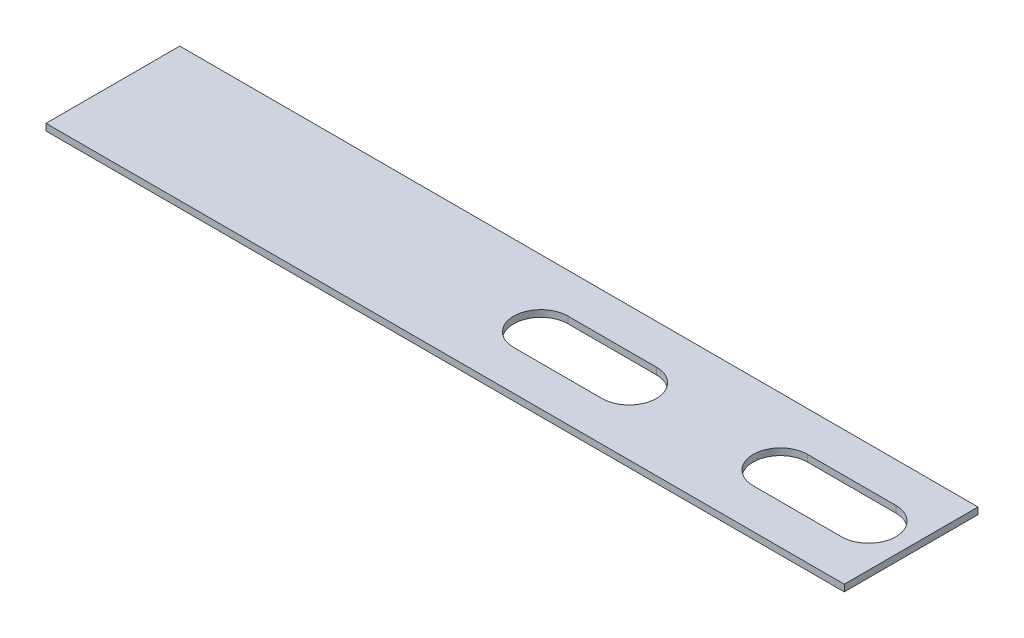
ISO-10303-21;
HEADER;
FILE_DESCRIPTION(('STEP AP214'),'2;1');
FILE_NAME('part.step','',(''),(''),'','','');
FILE_SCHEMA(('AUTOMOTIVE_DESIGN { 1 0 10303 214 1 1 1 1 }'));
ENDSEC;
DATA;
#1=APPLICATION_CONTEXT('core data for automotive mechanical design processes');
#2=APPLICATION_PROTOCOL_DEFINITION('international standard','automotive_design',2000,#1);
#3=PRODUCT_CONTEXT('',#1,'mechanical');
#4=PRODUCT('Part','Part','',(#3));
#5=PRODUCT_RELATED_PRODUCT_CATEGORY('part','',(#4));
#6=PRODUCT_DEFINITION_FORMATION('','',#4);
#7=PRODUCT_DEFINITION_CONTEXT('part definition',#1,'design');
#8=PRODUCT_DEFINITION('design','',#6,#7);
#9=PRODUCT_DEFINITION_SHAPE('','',#8);
#10=(LENGTH_UNIT() NAMED_UNIT(*) SI_UNIT(.MILLI.,.METRE.));
#11=(NAMED_UNIT(*) PLANE_ANGLE_UNIT() SI_UNIT($,.RADIAN.));
#12=(NAMED_UNIT(*) SI_UNIT($,.STERADIAN.) SOLID_ANGLE_UNIT());
#13=UNCERTAINTY_MEASURE_WITH_UNIT(LENGTH_MEASURE(1.E-05),#10,'distance_accuracy_value','');
#14=(GEOMETRIC_REPRESENTATION_CONTEXT(3) GLOBAL_UNCERTAINTY_ASSIGNED_CONTEXT((#13)) GLOBAL_UNIT_ASSIGNED_CONTEXT((#10,
#11,#12)) REPRESENTATION_CONTEXT('',''));
#15=CARTESIAN_POINT('',(0.,0.,0.));
#16=DIRECTION('',(0.,0.,1.));
#17=DIRECTION('',(1.,0.,0.));
#18=AXIS2_PLACEMENT_3D('',#15,#16,#17);
#19=CARTESIAN_POINT('',(0.,-0.5,10.));
#20=DIRECTION('',(0.,1.,0.));
#21=DIRECTION('',(0.,0.,1.));
#22=AXIS2_PLACEMENT_3D('',#19,#20,#21);
#23=PLANE('',#22);
#24=DIRECTION('',(-1.,0.,0.));
#25=VECTOR('',#24,1.);
#26=CARTESIAN_POINT('',(0.,-0.5,2.968));
#27=LINE('',#26,#25);
#28=CARTESIAN_POINT('',(56.515,-0.5,2.968));
#29=VERTEX_POINT('',#28);
#30=CARTESIAN_POINT('',(49.911,-0.5,2.968));
#31=VERTEX_POINT('',#30);
#32=EDGE_CURVE('E151',#29,#31,#27,.T.);
#33=ORIENTED_EDGE('',*,*,#32,.T.);
#34=CARTESIAN_POINT('',(49.911,-0.5,5.));
#35=DIRECTION('',(0.,1.,0.));
#36=DIRECTION('',(0.,0.,1.));
#37=AXIS2_PLACEMENT_3D('',#34,#35,#36);
#38=CIRCLE('',#37,2.032);
#39=CARTESIAN_POINT('',(49.911,-0.5,7.032));
#40=VERTEX_POINT('',#39);
#41=EDGE_CURVE('E154',#31,#40,#38,.T.);
#42=ORIENTED_EDGE('',*,*,#41,.T.);
#43=DIRECTION('',(1.,0.,0.));
#44=VECTOR('',#43,1.);
#45=CARTESIAN_POINT('',(0.,-0.5,7.032));
#46=LINE('',#45,#44);
#47=CARTESIAN_POINT('',(56.515,-0.5,7.032));
#48=VERTEX_POINT('',#47);
#49=EDGE_CURVE('E146',#40,#48,#46,.T.);
#50=ORIENTED_EDGE('',*,*,#49,.T.);
#51=CARTESIAN_POINT('',(56.515,-0.5,5.));
#52=DIRECTION('',(0.,1.,0.));
#53=DIRECTION('',(0.,0.,1.));
#54=AXIS2_PLACEMENT_3D('',#51,#52,#53);
#55=CIRCLE('',#54,2.032);
#56=EDGE_CURVE('E126',#48,#29,#55,.T.);
#57=ORIENTED_EDGE('',*,*,#56,.T.);
#58=EDGE_LOOP('',(#33,#42,#50,#57));
#59=FACE_BOUND('',#58,.T.);
#60=DIRECTION('',(-1.,0.,0.));
#61=VECTOR('',#60,1.);
#62=CARTESIAN_POINT('',(0.,-0.5,2.968));
#63=LINE('',#62,#61);
#64=CARTESIAN_POINT('',(38.608,-0.5,2.968));
#65=VERTEX_POINT('',#64);
#66=CARTESIAN_POINT('',(32.004,-0.5,2.968));
#67=VERTEX_POINT('',#66);
#68=EDGE_CURVE('E183',#65,#67,#63,.T.);
#69=ORIENTED_EDGE('',*,*,#68,.T.);
#70=CARTESIAN_POINT('',(32.004,-0.5,5.));
#71=DIRECTION('',(0.,1.,0.));
#72=DIRECTION('',(0.,0.,1.));
#73=AXIS2_PLACEMENT_3D('',#70,#71,#72);
#74=CIRCLE('',#73,2.032);
#75=CARTESIAN_POINT('',(32.004,-0.5,7.032));
#76=VERTEX_POINT('',#75);
#77=EDGE_CURVE('E186',#67,#76,#74,.T.);
#78=ORIENTED_EDGE('',*,*,#77,.T.);
#79=DIRECTION('',(1.,0.,0.));
#80=VECTOR('',#79,1.);
#81=CARTESIAN_POINT('',(0.,-0.5,7.032));
#82=LINE('',#81,#80);
#83=CARTESIAN_POINT('',(38.608,-0.5,7.032));
#84=VERTEX_POINT('',#83);
#85=EDGE_CURVE('E171',#76,#84,#82,.T.);
#86=ORIENTED_EDGE('',*,*,#85,.T.);
#87=CARTESIAN_POINT('',(38.608,-0.5,5.));
#88=DIRECTION('',(0.,1.,0.));
#89=DIRECTION('',(0.,0.,1.));
#90=AXIS2_PLACEMENT_3D('',#87,#88,#89);
#91=CIRCLE('',#90,2.032);
#92=EDGE_CURVE('E180',#84,#65,#91,.T.);
#93=ORIENTED_EDGE('',*,*,#92,.T.);
#94=EDGE_LOOP('',(#69,#78,#86,#93));
#95=FACE_BOUND('',#94,.T.);
#96=DIRECTION('',(1.,0.,0.));
#97=VECTOR('',#96,1.);
#98=CARTESIAN_POINT('',(0.,-0.5,0.));
#99=LINE('',#98,#97);
#100=CARTESIAN_POINT('',(0.,-0.5,0.));
#101=VERTEX_POINT('',#100);
#102=CARTESIAN_POINT('',(59.69,-0.5,0.));
#103=VERTEX_POINT('',#102);
#104=EDGE_CURVE('E189',#101,#103,#99,.T.);
#105=ORIENTED_EDGE('',*,*,#104,.T.);
#106=DIRECTION('',(0.,0.,-1.));
#107=VECTOR('',#106,1.);
#108=CARTESIAN_POINT('',(59.69,-0.5,10.));
#109=LINE('',#108,#107);
#110=CARTESIAN_POINT('',(59.69,-0.5,10.));
#111=VERTEX_POINT('',#110);
#112=EDGE_CURVE('E12',#111,#103,#109,.T.);
#113=ORIENTED_EDGE('',*,*,#112,.F.);
#114=DIRECTION('',(1.,0.,0.));
#115=VECTOR('',#114,1.);
#116=CARTESIAN_POINT('',(0.,-0.5,10.));
#117=LINE('',#116,#115);
#118=CARTESIAN_POINT('',(0.,-0.5,10.));
#119=VERTEX_POINT('',#118);
#120=EDGE_CURVE('E190',#119,#111,#117,.T.);
#121=ORIENTED_EDGE('',*,*,#120,.F.);
#122=DIRECTION('',(0.,0.,-1.));
#123=VECTOR('',#122,1.);
#124=CARTESIAN_POINT('',(0.,-0.5,10.));
#125=LINE('',#124,#123);
#126=EDGE_CURVE('E202',#119,#101,#125,.T.);
#127=ORIENTED_EDGE('',*,*,#126,.T.);
#128=EDGE_LOOP('',(#105,#113,#121,#127));
#129=FACE_BOUND('',#128,.T.);
#130=ADVANCED_FACE('F33',(#59,#95,#129),#23,.F.);
#131=CARTESIAN_POINT('',(59.69,0.,10.));
#132=DIRECTION('',(1.,0.,0.));
#133=DIRECTION('',(0.,0.,-1.));
#134=AXIS2_PLACEMENT_3D('',#131,#132,#133);
#135=PLANE('',#134);
#136=DIRECTION('',(0.,-1.,0.));
#137=VECTOR('',#136,1.);
#138=CARTESIAN_POINT('',(59.69,0.,0.));
#139=LINE('',#138,#137);
#140=CARTESIAN_POINT('',(59.69,0.,0.));
#141=VERTEX_POINT('',#140);
#142=EDGE_CURVE('E205',#141,#103,#139,.T.);
#143=ORIENTED_EDGE('',*,*,#142,.F.);
#144=DIRECTION('',(0.,0.,-1.));
#145=VECTOR('',#144,1.);
#146=CARTESIAN_POINT('',(59.69,0.,10.));
#147=LINE('',#146,#145);
#148=CARTESIAN_POINT('',(59.69,0.,10.));
#149=VERTEX_POINT('',#148);
#150=EDGE_CURVE('E40',#149,#141,#147,.T.);
#151=ORIENTED_EDGE('',*,*,#150,.F.);
#152=DIRECTION('',(0.,-1.,0.));
#153=VECTOR('',#152,1.);
#154=CARTESIAN_POINT('',(59.69,0.,10.));
#155=LINE('',#154,#153);
#156=EDGE_CURVE('E192',#149,#111,#155,.T.);
#157=ORIENTED_EDGE('',*,*,#156,.T.);
#158=ORIENTED_EDGE('',*,*,#112,.T.);
#159=EDGE_LOOP('',(#143,#151,#157,#158));
#160=FACE_BOUND('',#159,.T.);
#161=ADVANCED_FACE('F221',(#160),#135,.T.);
#162=CARTESIAN_POINT('',(0.,0.,10.));
#163=DIRECTION('',(0.,1.,0.));
#164=DIRECTION('',(0.,0.,1.));
#165=AXIS2_PLACEMENT_3D('',#162,#163,#164);
#166=PLANE('',#165);
#167=CARTESIAN_POINT('',(49.911,0.,5.));
#168=DIRECTION('',(0.,1.,0.));
#169=DIRECTION('',(0.,0.,1.));
#170=AXIS2_PLACEMENT_3D('',#167,#168,#169);
#171=CIRCLE('',#170,2.032);
#172=CARTESIAN_POINT('',(49.911,0.,2.968));
#173=VERTEX_POINT('',#172);
#174=CARTESIAN_POINT('',(49.911,0.,7.032));
#175=VERTEX_POINT('',#174);
#176=EDGE_CURVE('E55',#173,#175,#171,.T.);
#177=ORIENTED_EDGE('',*,*,#176,.F.);
#178=DIRECTION('',(-1.,0.,0.));
#179=VECTOR('',#178,1.);
#180=CARTESIAN_POINT('',(49.911,0.,2.968));
#181=LINE('',#180,#179);
#182=CARTESIAN_POINT('',(56.515,0.,2.968));
#183=VERTEX_POINT('',#182);
#184=EDGE_CURVE('E139',#183,#173,#181,.T.);
#185=ORIENTED_EDGE('',*,*,#184,.F.);
#186=CARTESIAN_POINT('',(56.515,0.,5.));
#187=DIRECTION('',(0.,1.,0.));
#188=DIRECTION('',(0.,0.,1.));
#189=AXIS2_PLACEMENT_3D('',#186,#187,#188);
#190=CIRCLE('',#189,2.032);
#191=CARTESIAN_POINT('',(56.515,0.,7.032));
#192=VERTEX_POINT('',#191);
#193=EDGE_CURVE('E123',#192,#183,#190,.T.);
#194=ORIENTED_EDGE('',*,*,#193,.F.);
#195=DIRECTION('',(1.,0.,0.));
#196=VECTOR('',#195,1.);
#197=CARTESIAN_POINT('',(49.911,0.,7.032));
#198=LINE('',#197,#196);
#199=EDGE_CURVE('E132',#175,#192,#198,.T.);
#200=ORIENTED_EDGE('',*,*,#199,.F.);
#201=EDGE_LOOP('',(#177,#185,#194,#200));
#202=FACE_BOUND('',#201,.T.);
#203=CARTESIAN_POINT('',(32.004,0.,5.));
#204=DIRECTION('',(0.,1.,0.));
#205=DIRECTION('',(0.,0.,1.));
#206=AXIS2_PLACEMENT_3D('',#203,#204,#205);
#207=CIRCLE('',#206,2.032);
#208=CARTESIAN_POINT('',(32.004,0.,2.968));
#209=VERTEX_POINT('',#208);
#210=CARTESIAN_POINT('',(32.004,0.,7.032));
#211=VERTEX_POINT('',#210);
#212=EDGE_CURVE('E157',#209,#211,#207,.T.);
#213=ORIENTED_EDGE('',*,*,#212,.F.);
#214=DIRECTION('',(-1.,0.,0.));
#215=VECTOR('',#214,1.);
#216=CARTESIAN_POINT('',(32.004,0.,2.968));
#217=LINE('',#216,#215);
#218=CARTESIAN_POINT('',(38.608,0.,2.968));
#219=VERTEX_POINT('',#218);
#220=EDGE_CURVE('E165',#219,#209,#217,.T.);
#221=ORIENTED_EDGE('',*,*,#220,.F.);
#222=CARTESIAN_POINT('',(38.608,0.,5.));
#223=DIRECTION('',(0.,1.,0.));
#224=DIRECTION('',(0.,0.,1.));
#225=AXIS2_PLACEMENT_3D('',#222,#223,#224);
#226=CIRCLE('',#225,2.032);
#227=CARTESIAN_POINT('',(38.608,0.,7.032));
#228=VERTEX_POINT('',#227);
#229=EDGE_CURVE('E162',#228,#219,#226,.T.);
#230=ORIENTED_EDGE('',*,*,#229,.F.);
#231=DIRECTION('',(1.,0.,0.));
#232=VECTOR('',#231,1.);
#233=CARTESIAN_POINT('',(32.004,0.,7.032));
#234=LINE('',#233,#232);
#235=EDGE_CURVE('E159',#211,#228,#234,.T.);
#236=ORIENTED_EDGE('',*,*,#235,.F.);
#237=EDGE_LOOP('',(#213,#221,#230,#236));
#238=FACE_BOUND('',#237,.T.);
#239=DIRECTION('',(1.,0.,0.));
#240=VECTOR('',#239,1.);
#241=CARTESIAN_POINT('',(0.,0.,0.));
#242=LINE('',#241,#240);
#243=CARTESIAN_POINT('',(0.,0.,0.));
#244=VERTEX_POINT('',#243);
#245=EDGE_CURVE('E208',#244,#141,#242,.T.);
#246=ORIENTED_EDGE('',*,*,#245,.F.);
#247=DIRECTION('',(0.,0.,-1.));
#248=VECTOR('',#247,1.);
#249=CARTESIAN_POINT('',(0.,0.,10.));
#250=LINE('',#249,#248);
#251=CARTESIAN_POINT('',(0.,0.,10.));
#252=VERTEX_POINT('',#251);
#253=EDGE_CURVE('E214',#252,#244,#250,.T.);
#254=ORIENTED_EDGE('',*,*,#253,.F.);
#255=DIRECTION('',(1.,0.,0.));
#256=VECTOR('',#255,1.);
#257=CARTESIAN_POINT('',(0.,0.,10.));
#258=LINE('',#257,#256);
#259=EDGE_CURVE('E196',#252,#149,#258,.T.);
#260=ORIENTED_EDGE('',*,*,#259,.T.);
#261=ORIENTED_EDGE('',*,*,#150,.T.);
#262=EDGE_LOOP('',(#246,#254,#260,#261));
#263=FACE_BOUND('',#262,.T.);
#264=ADVANCED_FACE('F136',(#202,#238,#263),#166,.T.);
#265=CARTESIAN_POINT('',(0.,-0.5,10.));
#266=DIRECTION('',(-1.,0.,0.));
#267=DIRECTION('',(0.,0.,1.));
#268=AXIS2_PLACEMENT_3D('',#265,#266,#267);
#269=PLANE('',#268);
#270=DIRECTION('',(0.,1.,0.));
#271=VECTOR('',#270,1.);
#272=CARTESIAN_POINT('',(0.,-0.5,0.));
#273=LINE('',#272,#271);
#274=EDGE_CURVE('E193',#101,#244,#273,.T.);
#275=ORIENTED_EDGE('',*,*,#274,.F.);
#276=ORIENTED_EDGE('',*,*,#126,.F.);
#277=DIRECTION('',(0.,1.,0.));
#278=VECTOR('',#277,1.);
#279=CARTESIAN_POINT('',(0.,-0.5,10.));
#280=LINE('',#279,#278);
#281=EDGE_CURVE('E199',#119,#252,#280,.T.);
#282=ORIENTED_EDGE('',*,*,#281,.T.);
#283=ORIENTED_EDGE('',*,*,#253,.T.);
#284=EDGE_LOOP('',(#275,#276,#282,#283));
#285=FACE_BOUND('',#284,.T.);
#286=ADVANCED_FACE('F228',(#285),#269,.T.);
#287=CARTESIAN_POINT('',(59.69,-0.5,10.));
#288=DIRECTION('',(0.,0.,-1.));
#289=DIRECTION('',(-1.,0.,0.));
#290=AXIS2_PLACEMENT_3D('',#287,#288,#289);
#291=PLANE('',#290);
#292=ORIENTED_EDGE('',*,*,#120,.T.);
#293=ORIENTED_EDGE('',*,*,#156,.F.);
#294=ORIENTED_EDGE('',*,*,#259,.F.);
#295=ORIENTED_EDGE('',*,*,#281,.F.);
#296=EDGE_LOOP('',(#292,#293,#294,#295));
#297=FACE_BOUND('',#296,.T.);
#298=ADVANCED_FACE('F232',(#297),#291,.F.);
#299=CARTESIAN_POINT('',(59.69,-0.5,0.));
#300=DIRECTION('',(0.,0.,-1.));
#301=DIRECTION('',(-1.,0.,0.));
#302=AXIS2_PLACEMENT_3D('',#299,#300,#301);
#303=PLANE('',#302);
#304=ORIENTED_EDGE('',*,*,#104,.F.);
#305=ORIENTED_EDGE('',*,*,#274,.T.);
#306=ORIENTED_EDGE('',*,*,#245,.T.);
#307=ORIENTED_EDGE('',*,*,#142,.T.);
#308=EDGE_LOOP('',(#304,#305,#306,#307));
#309=FACE_BOUND('',#308,.T.);
#310=ADVANCED_FACE('F225',(#309),#303,.T.);
#311=CARTESIAN_POINT('',(32.004,-2.54,5.));
#312=DIRECTION('',(0.,1.,0.));
#313=DIRECTION('',(0.,0.,1.));
#314=AXIS2_PLACEMENT_3D('',#311,#312,#313);
#315=CYLINDRICAL_SURFACE('',#314,2.032);
#316=DIRECTION('',(0.,1.,0.));
#317=VECTOR('',#316,1.);
#318=CARTESIAN_POINT('',(32.004,-2.54,2.968));
#319=LINE('',#318,#317);
#320=EDGE_CURVE('E169',#67,#209,#319,.T.);
#321=ORIENTED_EDGE('',*,*,#320,.T.);
#322=ORIENTED_EDGE('',*,*,#212,.T.);
#323=DIRECTION('',(0.,1.,0.));
#324=VECTOR('',#323,1.);
#325=CARTESIAN_POINT('',(32.004,-2.54,7.032));
#326=LINE('',#325,#324);
#327=EDGE_CURVE('E168',#76,#211,#326,.T.);
#328=ORIENTED_EDGE('',*,*,#327,.F.);
#329=ORIENTED_EDGE('',*,*,#77,.F.);
#330=EDGE_LOOP('',(#321,#322,#328,#329));
#331=FACE_BOUND('',#330,.T.);
#332=ADVANCED_FACE('F253',(#331),#315,.F.);
#333=CARTESIAN_POINT('',(32.004,-2.54,2.968));
#334=DIRECTION('',(0.,0.,-1.));
#335=DIRECTION('',(-1.,0.,0.));
#336=AXIS2_PLACEMENT_3D('',#333,#334,#335);
#337=PLANE('',#336);
#338=DIRECTION('',(0.,1.,0.));
#339=VECTOR('',#338,1.);
#340=CARTESIAN_POINT('',(38.608,-2.54,2.968));
#341=LINE('',#340,#339);
#342=EDGE_CURVE('E172',#65,#219,#341,.T.);
#343=ORIENTED_EDGE('',*,*,#342,.T.);
#344=ORIENTED_EDGE('',*,*,#220,.T.);
#345=ORIENTED_EDGE('',*,*,#320,.F.);
#346=ORIENTED_EDGE('',*,*,#68,.F.);
#347=EDGE_LOOP('',(#343,#344,#345,#346));
#348=FACE_BOUND('',#347,.T.);
#349=ADVANCED_FACE('F244',(#348),#337,.F.);
#350=CARTESIAN_POINT('',(38.608,-2.54,5.));
#351=DIRECTION('',(0.,1.,0.));
#352=DIRECTION('',(0.,0.,1.));
#353=AXIS2_PLACEMENT_3D('',#350,#351,#352);
#354=CYLINDRICAL_SURFACE('',#353,2.032);
#355=DIRECTION('',(0.,1.,0.));
#356=VECTOR('',#355,1.);
#357=CARTESIAN_POINT('',(38.608,-2.54,7.032));
#358=LINE('',#357,#356);
#359=EDGE_CURVE('E174',#84,#228,#358,.T.);
#360=ORIENTED_EDGE('',*,*,#359,.T.);
#361=ORIENTED_EDGE('',*,*,#229,.T.);
#362=ORIENTED_EDGE('',*,*,#342,.F.);
#363=ORIENTED_EDGE('',*,*,#92,.F.);
#364=EDGE_LOOP('',(#360,#361,#362,#363));
#365=FACE_BOUND('',#364,.T.);
#366=ADVANCED_FACE('F246',(#365),#354,.F.);
#367=CARTESIAN_POINT('',(32.004,-2.54,7.032));
#368=DIRECTION('',(0.,0.,1.));
#369=DIRECTION('',(1.,0.,0.));
#370=AXIS2_PLACEMENT_3D('',#367,#368,#369);
#371=PLANE('',#370);
#372=ORIENTED_EDGE('',*,*,#327,.T.);
#373=ORIENTED_EDGE('',*,*,#235,.T.);
#374=ORIENTED_EDGE('',*,*,#359,.F.);
#375=ORIENTED_EDGE('',*,*,#85,.F.);
#376=EDGE_LOOP('',(#372,#373,#374,#375));
#377=FACE_BOUND('',#376,.T.);
#378=ADVANCED_FACE('F255',(#377),#371,.F.);
#379=CARTESIAN_POINT('',(49.911,-2.54,5.));
#380=DIRECTION('',(0.,1.,0.));
#381=DIRECTION('',(0.,0.,1.));
#382=AXIS2_PLACEMENT_3D('',#379,#380,#381);
#383=CYLINDRICAL_SURFACE('',#382,2.032);
#384=DIRECTION('',(0.,1.,0.));
#385=VECTOR('',#384,1.);
#386=CARTESIAN_POINT('',(49.911,-2.54,2.968));
#387=LINE('',#386,#385);
#388=EDGE_CURVE('E144',#31,#173,#387,.T.);
#389=ORIENTED_EDGE('',*,*,#388,.T.);
#390=ORIENTED_EDGE('',*,*,#176,.T.);
#391=DIRECTION('',(0.,1.,0.));
#392=VECTOR('',#391,1.);
#393=CARTESIAN_POINT('',(49.911,-2.54,7.032));
#394=LINE('',#393,#392);
#395=EDGE_CURVE('E129',#40,#175,#394,.T.);
#396=ORIENTED_EDGE('',*,*,#395,.F.);
#397=ORIENTED_EDGE('',*,*,#41,.F.);
#398=EDGE_LOOP('',(#389,#390,#396,#397));
#399=FACE_BOUND('',#398,.T.);
#400=ADVANCED_FACE('F257',(#399),#383,.F.);
#401=CARTESIAN_POINT('',(49.911,-2.54,2.968));
#402=DIRECTION('',(0.,0.,-1.));
#403=DIRECTION('',(-1.,0.,0.));
#404=AXIS2_PLACEMENT_3D('',#401,#402,#403);
#405=PLANE('',#404);
#406=DIRECTION('',(0.,1.,0.));
#407=VECTOR('',#406,1.);
#408=CARTESIAN_POINT('',(56.515,-2.54,2.968));
#409=LINE('',#408,#407);
#410=EDGE_CURVE('E128',#29,#183,#409,.T.);
#411=ORIENTED_EDGE('',*,*,#410,.T.);
#412=ORIENTED_EDGE('',*,*,#184,.T.);
#413=ORIENTED_EDGE('',*,*,#388,.F.);
#414=ORIENTED_EDGE('',*,*,#32,.F.);
#415=EDGE_LOOP('',(#411,#412,#413,#414));
#416=FACE_BOUND('',#415,.T.);
#417=ADVANCED_FACE('F263',(#416),#405,.F.);
#418=CARTESIAN_POINT('',(56.515,-2.54,5.));
#419=DIRECTION('',(0.,1.,0.));
#420=DIRECTION('',(0.,0.,1.));
#421=AXIS2_PLACEMENT_3D('',#418,#419,#420);
#422=CYLINDRICAL_SURFACE('',#421,2.032);
#423=DIRECTION('',(0.,1.,0.));
#424=VECTOR('',#423,1.);
#425=CARTESIAN_POINT('',(56.515,-2.54,7.032));
#426=LINE('',#425,#424);
#427=EDGE_CURVE('E47',#48,#192,#426,.T.);
#428=ORIENTED_EDGE('',*,*,#427,.T.);
#429=ORIENTED_EDGE('',*,*,#193,.T.);
#430=ORIENTED_EDGE('',*,*,#410,.F.);
#431=ORIENTED_EDGE('',*,*,#56,.F.);
#432=EDGE_LOOP('',(#428,#429,#430,#431));
#433=FACE_BOUND('',#432,.T.);
#434=ADVANCED_FACE('F120',(#433),#422,.F.);
#435=CARTESIAN_POINT('',(49.911,-2.54,7.032));
#436=DIRECTION('',(0.,0.,1.));
#437=DIRECTION('',(1.,0.,0.));
#438=AXIS2_PLACEMENT_3D('',#435,#436,#437);
#439=PLANE('',#438);
#440=ORIENTED_EDGE('',*,*,#395,.T.);
#441=ORIENTED_EDGE('',*,*,#199,.T.);
#442=ORIENTED_EDGE('',*,*,#427,.F.);
#443=ORIENTED_EDGE('',*,*,#49,.F.);
#444=EDGE_LOOP('',(#440,#441,#442,#443));
#445=FACE_BOUND('',#444,.T.);
#446=ADVANCED_FACE('F133',(#445),#439,.F.);
#447=CLOSED_SHELL('',(#130,#161,#264,#286,#298,#310,#332,#349,#366,#378,#400,#417,#434,#446));
#448=MANIFOLD_SOLID_BREP('B2',#447);
#449=ADVANCED_BREP_SHAPE_REPRESENTATION('',(#18,#448),#14);
#450=SHAPE_DEFINITION_REPRESENTATION(#9,#449);
ENDSEC;
END-ISO-10303-21;
